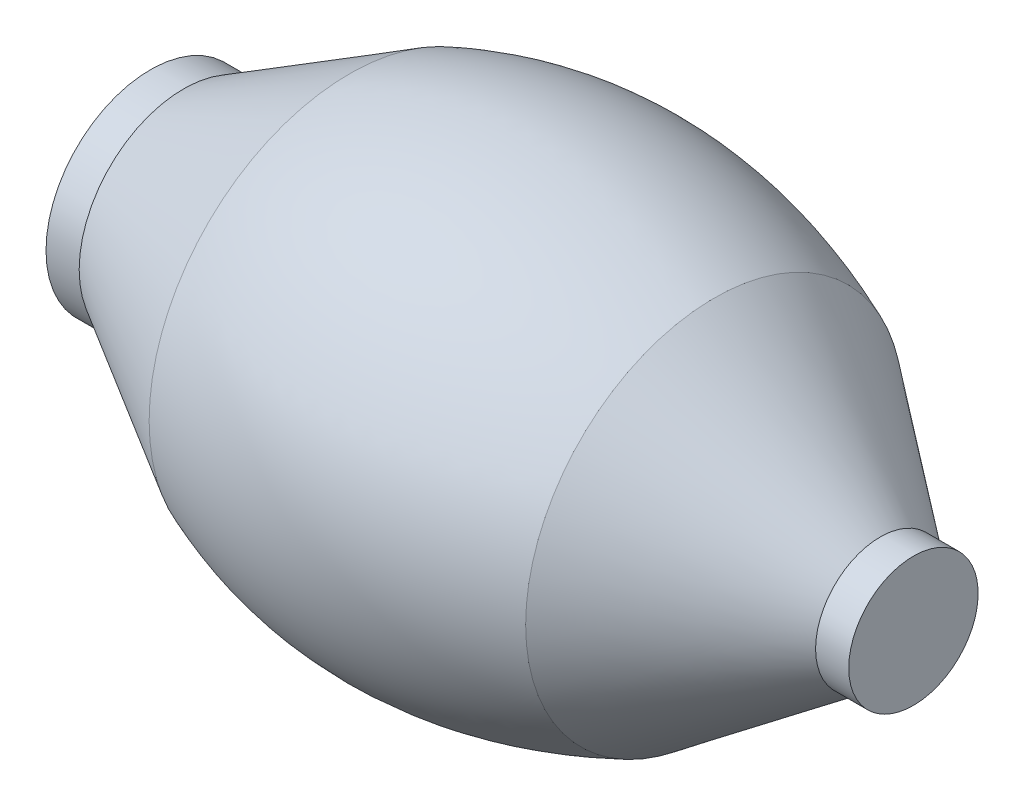
ISO-10303-21;
HEADER;
FILE_DESCRIPTION(('STEP AP214'),'2;1');
FILE_NAME('part.step','',(''),(''),'','','');
FILE_SCHEMA(('AUTOMOTIVE_DESIGN { 1 0 10303 214 1 1 1 1 }'));
ENDSEC;
DATA;
#1=APPLICATION_CONTEXT('core data for automotive mechanical design processes');
#2=APPLICATION_PROTOCOL_DEFINITION('international standard','automotive_design',2000,#1);
#3=PRODUCT_CONTEXT('',#1,'mechanical');
#4=PRODUCT('Part','Part','',(#3));
#5=PRODUCT_RELATED_PRODUCT_CATEGORY('part','',(#4));
#6=PRODUCT_DEFINITION_FORMATION('','',#4);
#7=PRODUCT_DEFINITION_CONTEXT('part definition',#1,'design');
#8=PRODUCT_DEFINITION('design','',#6,#7);
#9=PRODUCT_DEFINITION_SHAPE('','',#8);
#10=(LENGTH_UNIT() NAMED_UNIT(*) SI_UNIT(.MILLI.,.METRE.));
#11=(NAMED_UNIT(*) PLANE_ANGLE_UNIT() SI_UNIT($,.RADIAN.));
#12=(NAMED_UNIT(*) SI_UNIT($,.STERADIAN.) SOLID_ANGLE_UNIT());
#13=UNCERTAINTY_MEASURE_WITH_UNIT(LENGTH_MEASURE(1.E-05),#10,'distance_accuracy_value','');
#14=(GEOMETRIC_REPRESENTATION_CONTEXT(3) GLOBAL_UNCERTAINTY_ASSIGNED_CONTEXT((#13)) GLOBAL_UNIT_ASSIGNED_CONTEXT((#10,
#11,#12)) REPRESENTATION_CONTEXT('',''));
#15=CARTESIAN_POINT('',(0.,0.,0.));
#16=DIRECTION('',(0.,0.,1.));
#17=DIRECTION('',(1.,0.,0.));
#18=AXIS2_PLACEMENT_3D('',#15,#16,#17);
#19=CARTESIAN_POINT('',(60.,0.,-56.9066744076462));
#20=CARTESIAN_POINT('',(2.11146882883675,0.,-81.2061674834312));
#21=CARTESIAN_POINT('',(-50.,0.,-60.4089920638615));
#22=B_SPLINE_CURVE_WITH_KNOTS('',2,(#19,#20,#21),.UNSPECIFIED.,.F.,.F.,(3,3),(0.,1.),.UNSPECIFIED.);
#23=CARTESIAN_POINT('',(-72.8662420382166,0.,0.));
#24=DIRECTION('',(-1.,0.,0.));
#25=AXIS1_PLACEMENT('',#23,#24);
#26=SURFACE_OF_REVOLUTION('',#22,#25);
#27=CARTESIAN_POINT('',(-50.,0.,0.));
#28=DIRECTION('',(-1.,0.,0.));
#29=DIRECTION('',(0.,0.,1.));
#30=AXIS2_PLACEMENT_3D('',#27,#28,#29);
#31=CIRCLE('',#30,60.4089920638615);
#32=CARTESIAN_POINT('',(-50.,0.,60.4089920638615));
#33=VERTEX_POINT('',#32);
#34=EDGE_CURVE('E10',#33,#33,#31,.T.);
#35=ORIENTED_EDGE('',*,*,#34,.F.);
#36=EDGE_LOOP('',(#35));
#37=FACE_BOUND('',#36,.T.);
#38=CARTESIAN_POINT('',(60.,0.,0.));
#39=DIRECTION('',(-1.,0.,0.));
#40=DIRECTION('',(0.,0.,1.));
#41=AXIS2_PLACEMENT_3D('',#38,#39,#40);
#42=CIRCLE('',#41,56.9066744076462);
#43=CARTESIAN_POINT('',(60.,0.,56.9066744076462));
#44=VERTEX_POINT('',#43);
#45=EDGE_CURVE('E56',#44,#44,#42,.T.);
#46=ORIENTED_EDGE('',*,*,#45,.T.);
#47=EDGE_LOOP('',(#46));
#48=FACE_BOUND('',#47,.T.);
#49=ADVANCED_FACE('F33',(#37,#48),#26,.T.);
#50=CARTESIAN_POINT('',(-50.,0.,0.));
#51=DIRECTION('',(1.,0.,0.));
#52=DIRECTION('',(0.,0.,-1.));
#53=AXIS2_PLACEMENT_3D('',#50,#51,#52);
#54=CONICAL_SURFACE('',#53,60.4089920638615,0.524220731167851);
#55=CARTESIAN_POINT('',(-100.,0.,0.));
#56=DIRECTION('',(-1.,0.,0.));
#57=DIRECTION('',(0.,0.,1.));
#58=AXIS2_PLACEMENT_3D('',#55,#56,#57);
#59=CIRCLE('',#58,31.5);
#60=CARTESIAN_POINT('',(-100.,0.,31.5));
#61=VERTEX_POINT('',#60);
#62=EDGE_CURVE('E40',#61,#61,#59,.T.);
#63=ORIENTED_EDGE('',*,*,#62,.F.);
#64=EDGE_LOOP('',(#63));
#65=FACE_BOUND('',#64,.T.);
#66=ORIENTED_EDGE('',*,*,#34,.T.);
#67=EDGE_LOOP('',(#66));
#68=FACE_BOUND('',#67,.T.);
#69=ADVANCED_FACE('F90',(#65,#68),#54,.T.);
#70=CARTESIAN_POINT('',(-72.8662420382166,0.,0.));
#71=DIRECTION('',(-1.,0.,0.));
#72=DIRECTION('',(0.,0.,1.));
#73=AXIS2_PLACEMENT_3D('',#70,#71,#72);
#74=CYLINDRICAL_SURFACE('',#73,31.5);
#75=CARTESIAN_POINT('',(-110.,0.,0.));
#76=DIRECTION('',(-1.,0.,0.));
#77=DIRECTION('',(0.,0.,1.));
#78=AXIS2_PLACEMENT_3D('',#75,#76,#77);
#79=CIRCLE('',#78,31.5);
#80=CARTESIAN_POINT('',(-110.,0.,31.5));
#81=VERTEX_POINT('',#80);
#82=EDGE_CURVE('E44',#81,#81,#79,.T.);
#83=ORIENTED_EDGE('',*,*,#82,.F.);
#84=EDGE_LOOP('',(#83));
#85=FACE_BOUND('',#84,.T.);
#86=ORIENTED_EDGE('',*,*,#62,.T.);
#87=EDGE_LOOP('',(#86));
#88=FACE_BOUND('',#87,.T.);
#89=ADVANCED_FACE('F86',(#85,#88),#74,.T.);
#90=CARTESIAN_POINT('',(-110.,0.,-31.5));
#91=DIRECTION('',(1.,0.,0.));
#92=DIRECTION('',(0.,0.,-1.));
#93=AXIS2_PLACEMENT_3D('',#90,#91,#92);
#94=PLANE('',#93);
#95=ORIENTED_EDGE('',*,*,#82,.T.);
#96=EDGE_LOOP('',(#95));
#97=FACE_BOUND('',#96,.T.);
#98=ADVANCED_FACE('F81',(#97),#94,.F.);
#99=CARTESIAN_POINT('',(120.,0.,-19.5));
#100=DIRECTION('',(-1.,0.,0.));
#101=DIRECTION('',(0.,0.,1.));
#102=AXIS2_PLACEMENT_3D('',#99,#100,#101);
#103=PLANE('',#102);
#104=CARTESIAN_POINT('',(120.,0.,0.));
#105=DIRECTION('',(-1.,0.,0.));
#106=DIRECTION('',(0.,0.,1.));
#107=AXIS2_PLACEMENT_3D('',#104,#105,#106);
#108=CIRCLE('',#107,19.5);
#109=CARTESIAN_POINT('',(120.,0.,19.5));
#110=VERTEX_POINT('',#109);
#111=EDGE_CURVE('E48',#110,#110,#108,.T.);
#112=ORIENTED_EDGE('',*,*,#111,.F.);
#113=EDGE_LOOP('',(#112));
#114=FACE_BOUND('',#113,.T.);
#115=ADVANCED_FACE('F76',(#114),#103,.F.);
#116=CARTESIAN_POINT('',(-72.8662420382166,0.,0.));
#117=DIRECTION('',(-1.,0.,0.));
#118=DIRECTION('',(0.,0.,1.));
#119=AXIS2_PLACEMENT_3D('',#116,#117,#118);
#120=CYLINDRICAL_SURFACE('',#119,19.5);
#121=CARTESIAN_POINT('',(110.,0.,0.));
#122=DIRECTION('',(-1.,0.,0.));
#123=DIRECTION('',(0.,0.,1.));
#124=AXIS2_PLACEMENT_3D('',#121,#122,#123);
#125=CIRCLE('',#124,19.5);
#126=CARTESIAN_POINT('',(110.,0.,19.5));
#127=VERTEX_POINT('',#126);
#128=EDGE_CURVE('E53',#127,#127,#125,.T.);
#129=ORIENTED_EDGE('',*,*,#128,.F.);
#130=EDGE_LOOP('',(#129));
#131=FACE_BOUND('',#130,.T.);
#132=ORIENTED_EDGE('',*,*,#111,.T.);
#133=EDGE_LOOP('',(#132));
#134=FACE_BOUND('',#133,.T.);
#135=ADVANCED_FACE('F70',(#131,#134),#120,.T.);
#136=CARTESIAN_POINT('',(110.,0.,0.));
#137=DIRECTION('',(-1.,0.,0.));
#138=DIRECTION('',(0.,0.,1.));
#139=AXIS2_PLACEMENT_3D('',#136,#137,#138);
#140=CONICAL_SURFACE('',#139,19.5,0.642305470577398);
#141=ORIENTED_EDGE('',*,*,#45,.F.);
#142=EDGE_LOOP('',(#141));
#143=FACE_BOUND('',#142,.T.);
#144=ORIENTED_EDGE('',*,*,#128,.T.);
#145=EDGE_LOOP('',(#144));
#146=FACE_BOUND('',#145,.T.);
#147=ADVANCED_FACE('F67',(#143,#146),#140,.T.);
#148=CLOSED_SHELL('',(#49,#69,#89,#98,#115,#135,#147));
#149=MANIFOLD_SOLID_BREP('B2',#148);
#150=ADVANCED_BREP_SHAPE_REPRESENTATION('',(#18,#149),#14);
#151=SHAPE_DEFINITION_REPRESENTATION(#9,#150);
ENDSEC;
END-ISO-10303-21;
